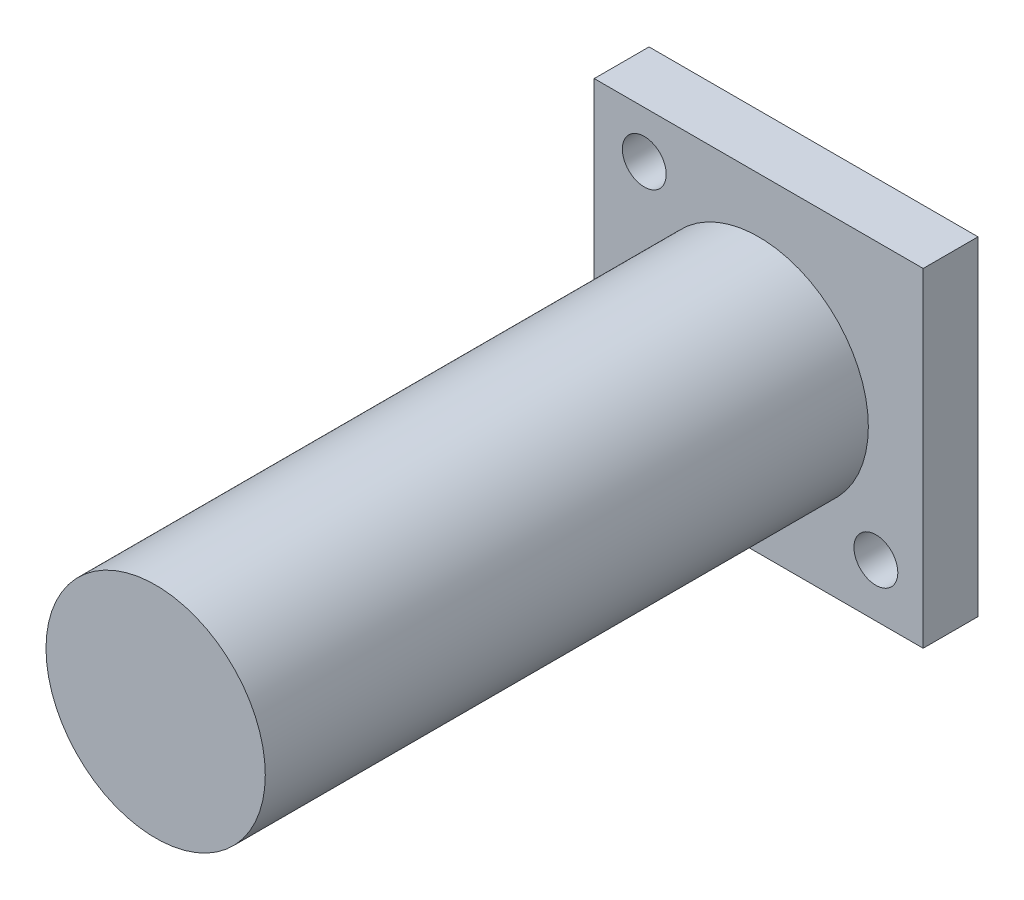
ISO-10303-21;
HEADER;
FILE_DESCRIPTION(('STEP AP214'),'2;1');
FILE_NAME('part.step','',(''),(''),'','','');
FILE_SCHEMA(('AUTOMOTIVE_DESIGN { 1 0 10303 214 1 1 1 1 }'));
ENDSEC;
DATA;
#1=APPLICATION_CONTEXT('core data for automotive mechanical design processes');
#2=APPLICATION_PROTOCOL_DEFINITION('international standard','automotive_design',2000,#1);
#3=PRODUCT_CONTEXT('',#1,'mechanical');
#4=PRODUCT('Part','Part','',(#3));
#5=PRODUCT_RELATED_PRODUCT_CATEGORY('part','',(#4));
#6=PRODUCT_DEFINITION_FORMATION('','',#4);
#7=PRODUCT_DEFINITION_CONTEXT('part definition',#1,'design');
#8=PRODUCT_DEFINITION('design','',#6,#7);
#9=PRODUCT_DEFINITION_SHAPE('','',#8);
#10=(LENGTH_UNIT() NAMED_UNIT(*) SI_UNIT(.MILLI.,.METRE.));
#11=(NAMED_UNIT(*) PLANE_ANGLE_UNIT() SI_UNIT($,.RADIAN.));
#12=(NAMED_UNIT(*) SI_UNIT($,.STERADIAN.) SOLID_ANGLE_UNIT());
#13=UNCERTAINTY_MEASURE_WITH_UNIT(LENGTH_MEASURE(1.E-05),#10,'distance_accuracy_value','');
#14=(GEOMETRIC_REPRESENTATION_CONTEXT(3) GLOBAL_UNCERTAINTY_ASSIGNED_CONTEXT((#13)) GLOBAL_UNIT_ASSIGNED_CONTEXT((#10,
#11,#12)) REPRESENTATION_CONTEXT('',''));
#15=CARTESIAN_POINT('',(0.,0.,0.));
#16=DIRECTION('',(0.,0.,1.));
#17=DIRECTION('',(1.,0.,0.));
#18=AXIS2_PLACEMENT_3D('',#15,#16,#17);
#19=CARTESIAN_POINT('',(0.,0.,60.));
#20=DIRECTION('',(0.,0.,-1.));
#21=DIRECTION('',(-1.,0.,0.));
#22=AXIS2_PLACEMENT_3D('',#19,#20,#21);
#23=CYLINDRICAL_SURFACE('',#22,10.);
#24=CARTESIAN_POINT('',(0.,0.,5.));
#25=DIRECTION('',(0.,0.,1.));
#26=DIRECTION('',(1.,0.,0.));
#27=AXIS2_PLACEMENT_3D('',#24,#25,#26);
#28=CIRCLE('',#27,10.);
#29=CARTESIAN_POINT('',(-10.,0.,4.99999999999999));
#30=VERTEX_POINT('',#29);
#31=EDGE_CURVE('E42',#30,#30,#28,.T.);
#32=CARTESIAN_POINT('',(0.,0.,60.));
#33=DIRECTION('',(0.,0.,1.));
#34=DIRECTION('',(1.,0.,0.));
#35=AXIS2_PLACEMENT_3D('',#32,#33,#34);
#36=CIRCLE('',#35,10.);
#37=CARTESIAN_POINT('',(-10.,0.,60.));
#38=VERTEX_POINT('',#37);
#39=EDGE_CURVE('E11',#38,#38,#36,.T.);
#40=CARTESIAN_POINT('',(-10.,0.,4.99999999999999));
#41=CARTESIAN_POINT('',(-10.,0.,5.57291666666666));
#42=CARTESIAN_POINT('',(-10.,0.,6.14583333333332));
#43=CARTESIAN_POINT('',(-10.,0.,7.29166666666666));
#44=CARTESIAN_POINT('',(-10.,0.,7.86458333333333));
#45=CARTESIAN_POINT('',(-10.,0.,9.01041666666666));
#46=CARTESIAN_POINT('',(-10.,0.,9.58333333333333));
#47=CARTESIAN_POINT('',(-10.,0.,10.7291666666667));
#48=CARTESIAN_POINT('',(-10.,0.,11.3020833333333));
#49=CARTESIAN_POINT('',(-10.,0.,12.4479166666667));
#50=CARTESIAN_POINT('',(-10.,0.,13.0208333333333));
#51=CARTESIAN_POINT('',(-10.,0.,14.1666666666667));
#52=CARTESIAN_POINT('',(-10.,0.,14.7395833333333));
#53=CARTESIAN_POINT('',(-10.,0.,15.8854166666667));
#54=CARTESIAN_POINT('',(-10.,0.,16.4583333333333));
#55=CARTESIAN_POINT('',(-10.,0.,17.6041666666667));
#56=CARTESIAN_POINT('',(-10.,0.,18.1770833333333));
#57=CARTESIAN_POINT('',(-10.,0.,19.3229166666667));
#58=CARTESIAN_POINT('',(-10.,0.,19.8958333333333));
#59=CARTESIAN_POINT('',(-10.,0.,21.0416666666667));
#60=CARTESIAN_POINT('',(-10.,0.,21.6145833333333));
#61=CARTESIAN_POINT('',(-10.,0.,22.7604166666667));
#62=CARTESIAN_POINT('',(-10.,0.,23.3333333333333));
#63=CARTESIAN_POINT('',(-10.,0.,24.4791666666667));
#64=CARTESIAN_POINT('',(-10.,0.,25.0520833333333));
#65=CARTESIAN_POINT('',(-10.,0.,26.1979166666667));
#66=CARTESIAN_POINT('',(-10.,0.,26.7708333333333));
#67=CARTESIAN_POINT('',(-10.,0.,27.9166666666667));
#68=CARTESIAN_POINT('',(-10.,0.,28.4895833333333));
#69=CARTESIAN_POINT('',(-10.,0.,29.6354166666667));
#70=CARTESIAN_POINT('',(-10.,0.,30.2083333333333));
#71=CARTESIAN_POINT('',(-10.,0.,31.3541666666667));
#72=CARTESIAN_POINT('',(-10.,0.,31.9270833333333));
#73=CARTESIAN_POINT('',(-10.,0.,33.0729166666667));
#74=CARTESIAN_POINT('',(-10.,0.,33.6458333333333));
#75=CARTESIAN_POINT('',(-10.,0.,34.7916666666667));
#76=CARTESIAN_POINT('',(-10.,0.,35.3645833333333));
#77=CARTESIAN_POINT('',(-10.,0.,36.5104166666667));
#78=CARTESIAN_POINT('',(-10.,0.,37.0833333333333));
#79=CARTESIAN_POINT('',(-10.,0.,38.2291666666667));
#80=CARTESIAN_POINT('',(-10.,0.,38.8020833333333));
#81=CARTESIAN_POINT('',(-10.,0.,39.9479166666667));
#82=CARTESIAN_POINT('',(-10.,0.,40.5208333333333));
#83=CARTESIAN_POINT('',(-10.,0.,41.6666666666667));
#84=CARTESIAN_POINT('',(-10.,0.,42.2395833333333));
#85=CARTESIAN_POINT('',(-10.,0.,43.3854166666667));
#86=CARTESIAN_POINT('',(-10.,0.,43.9583333333333));
#87=CARTESIAN_POINT('',(-10.,0.,45.1041666666667));
#88=CARTESIAN_POINT('',(-10.,0.,45.6770833333333));
#89=CARTESIAN_POINT('',(-10.,0.,46.8229166666667));
#90=CARTESIAN_POINT('',(-10.,0.,47.3958333333333));
#91=CARTESIAN_POINT('',(-10.,0.,48.5416666666667));
#92=CARTESIAN_POINT('',(-10.,0.,49.1145833333333));
#93=CARTESIAN_POINT('',(-10.,0.,50.2604166666667));
#94=CARTESIAN_POINT('',(-10.,0.,50.8333333333333));
#95=CARTESIAN_POINT('',(-10.,0.,51.9791666666667));
#96=CARTESIAN_POINT('',(-10.,0.,52.5520833333333));
#97=CARTESIAN_POINT('',(-10.,0.,53.6979166666667));
#98=CARTESIAN_POINT('',(-10.,0.,54.2708333333333));
#99=CARTESIAN_POINT('',(-10.,0.,55.4166666666667));
#100=CARTESIAN_POINT('',(-10.,0.,55.9895833333333));
#101=CARTESIAN_POINT('',(-10.,0.,57.1354166666667));
#102=CARTESIAN_POINT('',(-10.,0.,57.7083333333333));
#103=CARTESIAN_POINT('',(-10.,0.,58.8541666666667));
#104=CARTESIAN_POINT('',(-10.,0.,59.4270833333333));
#105=CARTESIAN_POINT('',(-10.,0.,60.));
#106=B_SPLINE_CURVE_WITH_KNOTS('',3,(#40,#41,#42,#43,#44,#45,#46,#47,#48,#49,#50,#51,#52,#53,
#54,#55,#56,#57,#58,#59,#60,#61,#62,#63,#64,#65,#66,#67,#68,#69,#70,#71,#72,#73,#74,#75,#76,#77,
#78,#79,#80,#81,#82,#83,#84,#85,#86,#87,#88,#89,#90,#91,#92,#93,#94,#95,#96,#97,#98,#99,#100,
#101,#102,#103,#104,#105),.UNSPECIFIED.,.F.,.F.,(4,2,2,2,2,2,2,2,2,2,2,2,2,2,2,2,2,2,2,2,2,2,2,
2,2,2,2,2,2,2,2,2,4),(0.,1.71875,3.4375,5.15625,6.87500000000001,8.59375,10.3125,12.03125,13.75,
15.46875,17.1875,18.90625,20.625,22.34375,24.0625,25.78125,27.5,29.21875,30.9375,32.65625,
34.375,36.09375,37.8125,39.53125,41.25,42.96875,44.6875,46.40625,48.125,49.84375,51.5625,
53.28125,55.),.UNSPECIFIED.);
#107=EDGE_CURVE('BSEAM39',#30,#38,#106,.T.);
#108=ORIENTED_EDGE('',*,*,#31,.T.);
#109=ORIENTED_EDGE('',*,*,#39,.F.);
#110=ORIENTED_EDGE('',*,*,#107,.T.);
#111=ORIENTED_EDGE('',*,*,#107,.F.);
#112=EDGE_LOOP('',(#108,#110,#109,#111));
#113=FACE_BOUND('',#112,.T.);
#114=ADVANCED_FACE('F39',(#113),#23,.T.);
#115=CARTESIAN_POINT('',(0.,0.,60.));
#116=DIRECTION('',(0.,0.,1.));
#117=DIRECTION('',(1.,0.,0.));
#118=AXIS2_PLACEMENT_3D('',#115,#116,#117);
#119=PLANE('',#118);
#120=ORIENTED_EDGE('',*,*,#39,.T.);
#121=EDGE_LOOP('',(#120));
#122=FACE_BOUND('',#121,.T.);
#123=ADVANCED_FACE('F142',(#122),#119,.T.);
#124=CARTESIAN_POINT('',(-15.,-15.,5.));
#125=DIRECTION('',(-1.,0.,0.));
#126=DIRECTION('',(0.,-1.,0.));
#127=AXIS2_PLACEMENT_3D('',#124,#125,#126);
#128=PLANE('',#127);
#129=DIRECTION('',(0.,1.,0.));
#130=VECTOR('',#129,1.);
#131=CARTESIAN_POINT('',(-15.,-15.,0.));
#132=LINE('',#131,#130);
#133=CARTESIAN_POINT('',(-15.,-15.,0.));
#134=VERTEX_POINT('',#133);
#135=CARTESIAN_POINT('',(-15.,15.,0.));
#136=VERTEX_POINT('',#135);
#137=EDGE_CURVE('E113',#134,#136,#132,.T.);
#138=ORIENTED_EDGE('',*,*,#137,.F.);
#139=DIRECTION('',(0.,0.,-1.));
#140=VECTOR('',#139,1.);
#141=CARTESIAN_POINT('',(-15.,-15.,5.));
#142=LINE('',#141,#140);
#143=CARTESIAN_POINT('',(-15.,-15.,5.));
#144=VERTEX_POINT('',#143);
#145=EDGE_CURVE('E56',#144,#134,#142,.T.);
#146=ORIENTED_EDGE('',*,*,#145,.F.);
#147=DIRECTION('',(0.,1.,0.));
#148=VECTOR('',#147,1.);
#149=CARTESIAN_POINT('',(-15.,-15.,5.));
#150=LINE('',#149,#148);
#151=CARTESIAN_POINT('',(-15.,15.,5.));
#152=VERTEX_POINT('',#151);
#153=EDGE_CURVE('E104',#144,#152,#150,.T.);
#154=ORIENTED_EDGE('',*,*,#153,.T.);
#155=DIRECTION('',(0.,0.,-1.));
#156=VECTOR('',#155,1.);
#157=CARTESIAN_POINT('',(-15.,15.,5.));
#158=LINE('',#157,#156);
#159=EDGE_CURVE('E84',#152,#136,#158,.T.);
#160=ORIENTED_EDGE('',*,*,#159,.T.);
#161=EDGE_LOOP('',(#138,#146,#154,#160));
#162=FACE_BOUND('',#161,.T.);
#163=ADVANCED_FACE('F131',(#162),#128,.T.);
#164=CARTESIAN_POINT('',(15.,-15.,5.));
#165=DIRECTION('',(0.,-1.,0.));
#166=DIRECTION('',(0.,0.,-1.));
#167=AXIS2_PLACEMENT_3D('',#164,#165,#166);
#168=PLANE('',#167);
#169=DIRECTION('',(-1.,0.,0.));
#170=VECTOR('',#169,1.);
#171=CARTESIAN_POINT('',(15.,-15.,0.));
#172=LINE('',#171,#170);
#173=CARTESIAN_POINT('',(15.,-15.,0.));
#174=VERTEX_POINT('',#173);
#175=EDGE_CURVE('E107',#174,#134,#172,.T.);
#176=ORIENTED_EDGE('',*,*,#175,.F.);
#177=DIRECTION('',(0.,0.,-1.));
#178=VECTOR('',#177,1.);
#179=CARTESIAN_POINT('',(15.,-15.,5.));
#180=LINE('',#179,#178);
#181=CARTESIAN_POINT('',(15.,-15.,5.));
#182=VERTEX_POINT('',#181);
#183=EDGE_CURVE('E73',#182,#174,#180,.T.);
#184=ORIENTED_EDGE('',*,*,#183,.F.);
#185=DIRECTION('',(-1.,0.,0.));
#186=VECTOR('',#185,1.);
#187=CARTESIAN_POINT('',(15.,-15.,5.));
#188=LINE('',#187,#186);
#189=EDGE_CURVE('E99',#182,#144,#188,.T.);
#190=ORIENTED_EDGE('',*,*,#189,.T.);
#191=ORIENTED_EDGE('',*,*,#145,.T.);
#192=EDGE_LOOP('',(#176,#184,#190,#191));
#193=FACE_BOUND('',#192,.T.);
#194=ADVANCED_FACE('F134',(#193),#168,.T.);
#195=CARTESIAN_POINT('',(15.,-15.,5.));
#196=DIRECTION('',(1.,0.,0.));
#197=DIRECTION('',(0.,1.,0.));
#198=AXIS2_PLACEMENT_3D('',#195,#196,#197);
#199=PLANE('',#198);
#200=DIRECTION('',(0.,-1.,0.));
#201=VECTOR('',#200,1.);
#202=CARTESIAN_POINT('',(15.,-15.,0.));
#203=LINE('',#202,#201);
#204=CARTESIAN_POINT('',(15.,15.,0.));
#205=VERTEX_POINT('',#204);
#206=EDGE_CURVE('E92',#205,#174,#203,.T.);
#207=ORIENTED_EDGE('',*,*,#206,.F.);
#208=DIRECTION('',(0.,0.,-1.));
#209=VECTOR('',#208,1.);
#210=CARTESIAN_POINT('',(15.,15.,5.));
#211=LINE('',#210,#209);
#212=CARTESIAN_POINT('',(15.,15.,5.));
#213=VERTEX_POINT('',#212);
#214=EDGE_CURVE('E87',#213,#205,#211,.T.);
#215=ORIENTED_EDGE('',*,*,#214,.F.);
#216=DIRECTION('',(0.,-1.,0.));
#217=VECTOR('',#216,1.);
#218=CARTESIAN_POINT('',(15.,-15.,5.));
#219=LINE('',#218,#217);
#220=EDGE_CURVE('E90',#213,#182,#219,.T.);
#221=ORIENTED_EDGE('',*,*,#220,.T.);
#222=ORIENTED_EDGE('',*,*,#183,.T.);
#223=EDGE_LOOP('',(#207,#215,#221,#222));
#224=FACE_BOUND('',#223,.T.);
#225=ADVANCED_FACE('F89',(#224),#199,.T.);
#226=CARTESIAN_POINT('',(15.,15.,5.));
#227=DIRECTION('',(0.,1.,0.));
#228=DIRECTION('',(0.,0.,1.));
#229=AXIS2_PLACEMENT_3D('',#226,#227,#228);
#230=PLANE('',#229);
#231=DIRECTION('',(1.,0.,0.));
#232=VECTOR('',#231,1.);
#233=CARTESIAN_POINT('',(15.,15.,0.));
#234=LINE('',#233,#232);
#235=EDGE_CURVE('E117',#136,#205,#234,.T.);
#236=ORIENTED_EDGE('',*,*,#235,.F.);
#237=ORIENTED_EDGE('',*,*,#159,.F.);
#238=DIRECTION('',(1.,0.,0.));
#239=VECTOR('',#238,1.);
#240=CARTESIAN_POINT('',(15.,15.,5.));
#241=LINE('',#240,#239);
#242=EDGE_CURVE('E98',#152,#213,#241,.T.);
#243=ORIENTED_EDGE('',*,*,#242,.T.);
#244=ORIENTED_EDGE('',*,*,#214,.T.);
#245=EDGE_LOOP('',(#236,#237,#243,#244));
#246=FACE_BOUND('',#245,.T.);
#247=ADVANCED_FACE('F102',(#246),#230,.T.);
#248=CARTESIAN_POINT('',(0.,0.,5.));
#249=DIRECTION('',(0.,0.,1.));
#250=DIRECTION('',(1.,0.,0.));
#251=AXIS2_PLACEMENT_3D('',#248,#249,#250);
#252=PLANE('',#251);
#253=CARTESIAN_POINT('',(-10.4335273113174,10.7159682462657,5.));
#254=DIRECTION('',(0.,0.,1.));
#255=DIRECTION('',(1.,0.,0.));
#256=AXIS2_PLACEMENT_3D('',#253,#254,#255);
#257=CIRCLE('',#256,2.);
#258=CARTESIAN_POINT('',(-8.43352731131741,10.7159682462657,5.));
#259=VERTEX_POINT('',#258);
#260=EDGE_CURVE('E180',#259,#259,#257,.T.);
#261=ORIENTED_EDGE('',*,*,#260,.F.);
#262=EDGE_LOOP('',(#261));
#263=FACE_BOUND('',#262,.T.);
#264=CARTESIAN_POINT('',(10.6870746075686,-10.1838608302626,5.));
#265=DIRECTION('',(0.,0.,1.));
#266=DIRECTION('',(1.,0.,0.));
#267=AXIS2_PLACEMENT_3D('',#264,#265,#266);
#268=CIRCLE('',#267,2.);
#269=CARTESIAN_POINT('',(12.6870746075686,-10.1838608302626,5.));
#270=VERTEX_POINT('',#269);
#271=EDGE_CURVE('E185',#270,#270,#268,.T.);
#272=ORIENTED_EDGE('',*,*,#271,.F.);
#273=EDGE_LOOP('',(#272));
#274=FACE_BOUND('',#273,.T.);
#275=ORIENTED_EDGE('',*,*,#31,.F.);
#276=EDGE_LOOP('',(#275));
#277=FACE_BOUND('',#276,.T.);
#278=ORIENTED_EDGE('',*,*,#153,.F.);
#279=ORIENTED_EDGE('',*,*,#189,.F.);
#280=ORIENTED_EDGE('',*,*,#220,.F.);
#281=ORIENTED_EDGE('',*,*,#242,.F.);
#282=EDGE_LOOP('',(#278,#279,#280,#281));
#283=FACE_BOUND('',#282,.T.);
#284=ADVANCED_FACE('F97',(#263,#274,#277,#283),#252,.T.);
#285=CARTESIAN_POINT('',(0.,0.,0.));
#286=DIRECTION('',(0.,0.,1.));
#287=DIRECTION('',(1.,0.,0.));
#288=AXIS2_PLACEMENT_3D('',#285,#286,#287);
#289=PLANE('',#288);
#290=CARTESIAN_POINT('',(-10.4335273113174,10.7159682462657,0.));
#291=DIRECTION('',(0.,0.,1.));
#292=DIRECTION('',(1.,0.,0.));
#293=AXIS2_PLACEMENT_3D('',#290,#291,#292);
#294=CIRCLE('',#293,1.99999999999999);
#295=CARTESIAN_POINT('',(-8.43352731131741,10.7159682462657,0.));
#296=VERTEX_POINT('',#295);
#297=EDGE_CURVE('E183',#296,#296,#294,.T.);
#298=ORIENTED_EDGE('',*,*,#297,.T.);
#299=EDGE_LOOP('',(#298));
#300=FACE_BOUND('',#299,.T.);
#301=CARTESIAN_POINT('',(10.6870746075686,-10.1838608302626,0.));
#302=DIRECTION('',(0.,0.,1.));
#303=DIRECTION('',(1.,0.,0.));
#304=AXIS2_PLACEMENT_3D('',#301,#302,#303);
#305=CIRCLE('',#304,1.99999999999999);
#306=CARTESIAN_POINT('',(12.6870746075686,-10.1838608302626,0.));
#307=VERTEX_POINT('',#306);
#308=EDGE_CURVE('E118',#307,#307,#305,.T.);
#309=ORIENTED_EDGE('',*,*,#308,.T.);
#310=EDGE_LOOP('',(#309));
#311=FACE_BOUND('',#310,.T.);
#312=ORIENTED_EDGE('',*,*,#137,.T.);
#313=ORIENTED_EDGE('',*,*,#235,.T.);
#314=ORIENTED_EDGE('',*,*,#206,.T.);
#315=ORIENTED_EDGE('',*,*,#175,.T.);
#316=EDGE_LOOP('',(#312,#313,#314,#315));
#317=FACE_BOUND('',#316,.T.);
#318=ADVANCED_FACE('F133',(#300,#311,#317),#289,.F.);
#319=CARTESIAN_POINT('',(10.6870746075686,-10.1838608302626,5.));
#320=DIRECTION('',(0.,0.,1.));
#321=DIRECTION('',(1.,0.,0.));
#322=AXIS2_PLACEMENT_3D('',#319,#320,#321);
#323=CYLINDRICAL_SURFACE('',#322,1.99999999999999);
#324=ORIENTED_EDGE('',*,*,#271,.T.);
#325=EDGE_LOOP('',(#324));
#326=FACE_BOUND('',#325,.T.);
#327=ORIENTED_EDGE('',*,*,#308,.F.);
#328=EDGE_LOOP('',(#327));
#329=FACE_BOUND('',#328,.T.);
#330=ADVANCED_FACE('F164',(#326,#329),#323,.F.);
#331=CARTESIAN_POINT('',(-10.4335273113174,10.7159682462657,5.));
#332=DIRECTION('',(0.,0.,1.));
#333=DIRECTION('',(1.,0.,0.));
#334=AXIS2_PLACEMENT_3D('',#331,#332,#333);
#335=CYLINDRICAL_SURFACE('',#334,1.99999999999999);
#336=ORIENTED_EDGE('',*,*,#260,.T.);
#337=EDGE_LOOP('',(#336));
#338=FACE_BOUND('',#337,.T.);
#339=ORIENTED_EDGE('',*,*,#297,.F.);
#340=EDGE_LOOP('',(#339));
#341=FACE_BOUND('',#340,.T.);
#342=ADVANCED_FACE('F172',(#338,#341),#335,.F.);
#343=CLOSED_SHELL('',(#114,#123,#163,#194,#225,#247,#284,#318,#330,#342));
#344=MANIFOLD_SOLID_BREP('B2',#343);
#345=ADVANCED_BREP_SHAPE_REPRESENTATION('',(#18,#344),#14);
#346=SHAPE_DEFINITION_REPRESENTATION(#9,#345);
ENDSEC;
END-ISO-10303-21;
